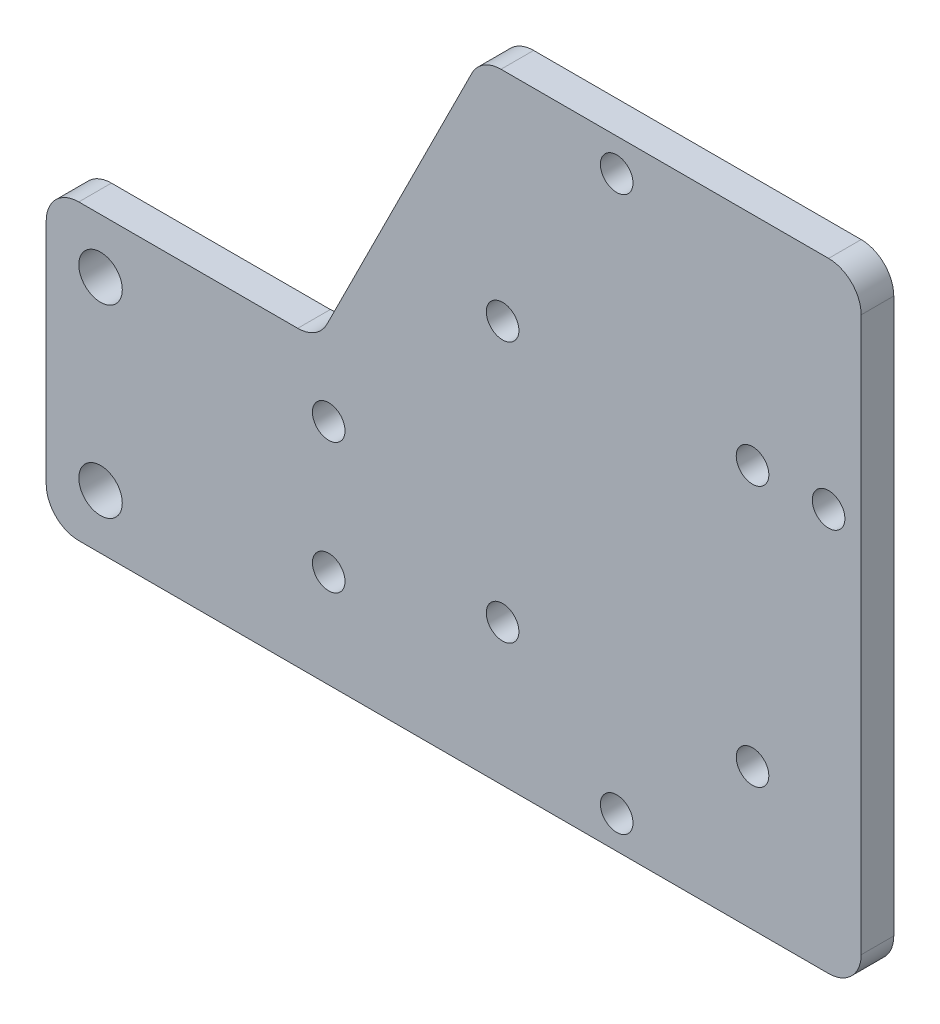
ISO-10303-21;
HEADER;
FILE_DESCRIPTION(('STEP AP214'),'2;1');
FILE_NAME('part.step','',(''),(''),'','','');
FILE_SCHEMA(('AUTOMOTIVE_DESIGN { 1 0 10303 214 1 1 1 1 }'));
ENDSEC;
DATA;
#1=APPLICATION_CONTEXT('core data for automotive mechanical design processes');
#2=APPLICATION_PROTOCOL_DEFINITION('international standard','automotive_design',2000,#1);
#3=PRODUCT_CONTEXT('',#1,'mechanical');
#4=PRODUCT('Part','Part','',(#3));
#5=PRODUCT_RELATED_PRODUCT_CATEGORY('part','',(#4));
#6=PRODUCT_DEFINITION_FORMATION('','',#4);
#7=PRODUCT_DEFINITION_CONTEXT('part definition',#1,'design');
#8=PRODUCT_DEFINITION('design','',#6,#7);
#9=PRODUCT_DEFINITION_SHAPE('','',#8);
#10=(LENGTH_UNIT() NAMED_UNIT(*) SI_UNIT(.MILLI.,.METRE.));
#11=(NAMED_UNIT(*) PLANE_ANGLE_UNIT() SI_UNIT($,.RADIAN.));
#12=(NAMED_UNIT(*) SI_UNIT($,.STERADIAN.) SOLID_ANGLE_UNIT());
#13=UNCERTAINTY_MEASURE_WITH_UNIT(LENGTH_MEASURE(1.E-05),#10,'distance_accuracy_value','');
#14=(GEOMETRIC_REPRESENTATION_CONTEXT(3) GLOBAL_UNCERTAINTY_ASSIGNED_CONTEXT((#13)) GLOBAL_UNIT_ASSIGNED_CONTEXT((#10,
#11,#12)) REPRESENTATION_CONTEXT('',''));
#15=CARTESIAN_POINT('',(0.,0.,0.));
#16=DIRECTION('',(0.,0.,1.));
#17=DIRECTION('',(1.,0.,0.));
#18=AXIS2_PLACEMENT_3D('',#15,#16,#17);
#19=CARTESIAN_POINT('',(0.,0.,3.));
#20=DIRECTION('',(1.,0.,0.));
#21=DIRECTION('',(0.,0.,-1.));
#22=AXIS2_PLACEMENT_3D('',#19,#20,#21);
#23=PLANE('',#22);
#24=DIRECTION('',(0.,-1.,0.));
#25=VECTOR('',#24,1.);
#26=CARTESIAN_POINT('',(0.,0.,3.));
#27=LINE('',#26,#25);
#28=CARTESIAN_POINT('',(0.,24.,3.));
#29=VERTEX_POINT('',#28);
#30=CARTESIAN_POINT('',(0.,3.,3.));
#31=VERTEX_POINT('',#30);
#32=EDGE_CURVE('E142',#29,#31,#27,.T.);
#33=ORIENTED_EDGE('',*,*,#32,.F.);
#34=DIRECTION('',(0.,0.,-1.));
#35=VECTOR('',#34,1.);
#36=CARTESIAN_POINT('',(0.,24.,3.));
#37=LINE('',#36,#35);
#38=CARTESIAN_POINT('',(0.,24.,0.));
#39=VERTEX_POINT('',#38);
#40=EDGE_CURVE('E127',#29,#39,#37,.T.);
#41=ORIENTED_EDGE('',*,*,#40,.T.);
#42=DIRECTION('',(0.,-1.,0.));
#43=VECTOR('',#42,1.);
#44=CARTESIAN_POINT('',(0.,0.,0.));
#45=LINE('',#44,#43);
#46=CARTESIAN_POINT('',(0.,3.,0.));
#47=VERTEX_POINT('',#46);
#48=EDGE_CURVE('E139',#39,#47,#45,.T.);
#49=ORIENTED_EDGE('',*,*,#48,.T.);
#50=DIRECTION('',(0.,0.,-1.));
#51=VECTOR('',#50,1.);
#52=CARTESIAN_POINT('',(0.,3.,3.));
#53=LINE('',#52,#51);
#54=EDGE_CURVE('E144',#47,#31,#53,.F.);
#55=ORIENTED_EDGE('',*,*,#54,.T.);
#56=EDGE_LOOP('',(#33,#41,#49,#55));
#57=FACE_BOUND('',#56,.T.);
#58=ADVANCED_FACE('F33',(#57),#23,.F.);
#59=CARTESIAN_POINT('',(0.,0.,3.));
#60=DIRECTION('',(0.,1.,0.));
#61=DIRECTION('',(0.,0.,1.));
#62=AXIS2_PLACEMENT_3D('',#59,#60,#61);
#63=PLANE('',#62);
#64=DIRECTION('',(1.,0.,0.));
#65=VECTOR('',#64,1.);
#66=CARTESIAN_POINT('',(0.,0.,0.));
#67=LINE('',#66,#65);
#68=CARTESIAN_POINT('',(3.,0.,0.));
#69=VERTEX_POINT('',#68);
#70=CARTESIAN_POINT('',(72.,0.,0.));
#71=VERTEX_POINT('',#70);
#72=EDGE_CURVE('E149',#69,#71,#67,.T.);
#73=ORIENTED_EDGE('',*,*,#72,.T.);
#74=DIRECTION('',(0.,0.,-1.));
#75=VECTOR('',#74,1.);
#76=CARTESIAN_POINT('',(72.,0.,3.));
#77=LINE('',#76,#75);
#78=CARTESIAN_POINT('',(72.,0.,3.));
#79=VERTEX_POINT('',#78);
#80=EDGE_CURVE('E206',#71,#79,#77,.F.);
#81=ORIENTED_EDGE('',*,*,#80,.T.);
#82=DIRECTION('',(1.,0.,0.));
#83=VECTOR('',#82,1.);
#84=CARTESIAN_POINT('',(0.,0.,3.));
#85=LINE('',#84,#83);
#86=CARTESIAN_POINT('',(3.,0.,3.));
#87=VERTEX_POINT('',#86);
#88=EDGE_CURVE('E226',#87,#79,#85,.T.);
#89=ORIENTED_EDGE('',*,*,#88,.F.);
#90=DIRECTION('',(0.,0.,-1.));
#91=VECTOR('',#90,1.);
#92=CARTESIAN_POINT('',(3.,0.,3.));
#93=LINE('',#92,#91);
#94=EDGE_CURVE('E203',#87,#69,#93,.T.);
#95=ORIENTED_EDGE('',*,*,#94,.T.);
#96=EDGE_LOOP('',(#73,#81,#89,#95));
#97=FACE_BOUND('',#96,.T.);
#98=ADVANCED_FACE('F341',(#97),#63,.F.);
#99=CARTESIAN_POINT('',(75.,0.,3.));
#100=DIRECTION('',(-1.,0.,0.));
#101=DIRECTION('',(0.,0.,1.));
#102=AXIS2_PLACEMENT_3D('',#99,#100,#101);
#103=PLANE('',#102);
#104=DIRECTION('',(0.,1.,0.));
#105=VECTOR('',#104,1.);
#106=CARTESIAN_POINT('',(75.,0.,3.));
#107=LINE('',#106,#105);
#108=CARTESIAN_POINT('',(75.,3.,3.));
#109=VERTEX_POINT('',#108);
#110=CARTESIAN_POINT('',(75.,54.,3.));
#111=VERTEX_POINT('',#110);
#112=EDGE_CURVE('E221',#109,#111,#107,.T.);
#113=ORIENTED_EDGE('',*,*,#112,.F.);
#114=DIRECTION('',(0.,0.,-1.));
#115=VECTOR('',#114,1.);
#116=CARTESIAN_POINT('',(75.,3.,3.));
#117=LINE('',#116,#115);
#118=CARTESIAN_POINT('',(75.,3.,0.));
#119=VERTEX_POINT('',#118);
#120=EDGE_CURVE('E200',#109,#119,#117,.T.);
#121=ORIENTED_EDGE('',*,*,#120,.T.);
#122=DIRECTION('',(0.,1.,0.));
#123=VECTOR('',#122,1.);
#124=CARTESIAN_POINT('',(75.,0.,0.));
#125=LINE('',#124,#123);
#126=CARTESIAN_POINT('',(75.,54.,0.));
#127=VERTEX_POINT('',#126);
#128=EDGE_CURVE('E153',#119,#127,#125,.T.);
#129=ORIENTED_EDGE('',*,*,#128,.T.);
#130=DIRECTION('',(0.,0.,-1.));
#131=VECTOR('',#130,1.);
#132=CARTESIAN_POINT('',(75.,54.,3.));
#133=LINE('',#132,#131);
#134=EDGE_CURVE('E198',#127,#111,#133,.F.);
#135=ORIENTED_EDGE('',*,*,#134,.T.);
#136=EDGE_LOOP('',(#113,#121,#129,#135));
#137=FACE_BOUND('',#136,.T.);
#138=ADVANCED_FACE('F347',(#137),#103,.F.);
#139=CARTESIAN_POINT('',(40.,57.,3.));
#140=DIRECTION('',(0.,-1.,0.));
#141=DIRECTION('',(0.,0.,-1.));
#142=AXIS2_PLACEMENT_3D('',#139,#140,#141);
#143=PLANE('',#142);
#144=DIRECTION('',(-1.,0.,0.));
#145=VECTOR('',#144,1.);
#146=CARTESIAN_POINT('',(40.,57.,0.));
#147=LINE('',#146,#145);
#148=CARTESIAN_POINT('',(72.,57.,0.));
#149=VERTEX_POINT('',#148);
#150=CARTESIAN_POINT('',(41.8541019662497,57.,0.));
#151=VERTEX_POINT('',#150);
#152=EDGE_CURVE('E164',#149,#151,#147,.T.);
#153=ORIENTED_EDGE('',*,*,#152,.T.);
#154=DIRECTION('',(0.,0.,-1.));
#155=VECTOR('',#154,1.);
#156=CARTESIAN_POINT('',(41.8541019662497,57.,3.));
#157=LINE('',#156,#155);
#158=CARTESIAN_POINT('',(41.8541019662497,57.,3.));
#159=VERTEX_POINT('',#158);
#160=EDGE_CURVE('E196',#151,#159,#157,.F.);
#161=ORIENTED_EDGE('',*,*,#160,.T.);
#162=DIRECTION('',(-1.,0.,0.));
#163=VECTOR('',#162,1.);
#164=CARTESIAN_POINT('',(40.,57.,3.));
#165=LINE('',#164,#163);
#166=CARTESIAN_POINT('',(72.,57.,3.));
#167=VERTEX_POINT('',#166);
#168=EDGE_CURVE('E220',#167,#159,#165,.T.);
#169=ORIENTED_EDGE('',*,*,#168,.F.);
#170=DIRECTION('',(0.,0.,-1.));
#171=VECTOR('',#170,1.);
#172=CARTESIAN_POINT('',(72.,57.,3.));
#173=LINE('',#172,#171);
#174=EDGE_CURVE('E193',#167,#149,#173,.T.);
#175=ORIENTED_EDGE('',*,*,#174,.T.);
#176=EDGE_LOOP('',(#153,#161,#169,#175));
#177=FACE_BOUND('',#176,.T.);
#178=ADVANCED_FACE('F385',(#177),#143,.F.);
#179=CARTESIAN_POINT('',(40.,57.,3.));
#180=DIRECTION('',(0.894427190999916,-0.447213595499958,0.));
#181=DIRECTION('',(0.447213595499958,0.894427190999916,0.));
#182=AXIS2_PLACEMENT_3D('',#179,#180,#181);
#183=PLANE('',#182);
#184=DIRECTION('',(-0.447213595499958,-0.894427190999916,0.));
#185=VECTOR('',#184,1.);
#186=CARTESIAN_POINT('',(40.,57.,0.));
#187=LINE('',#186,#185);
#188=CARTESIAN_POINT('',(39.1708203932499,55.3416407864999,0.));
#189=VERTEX_POINT('',#188);
#190=CARTESIAN_POINT('',(25.8291796067501,28.6583592135001,0.));
#191=VERTEX_POINT('',#190);
#192=EDGE_CURVE('E167',#189,#191,#187,.T.);
#193=ORIENTED_EDGE('',*,*,#192,.T.);
#194=DIRECTION('',(0.,0.,-1.));
#195=VECTOR('',#194,1.);
#196=CARTESIAN_POINT('',(25.8291796067501,28.6583592135001,3.));
#197=LINE('',#196,#195);
#198=CARTESIAN_POINT('',(25.8291796067501,28.6583592135001,3.));
#199=VERTEX_POINT('',#198);
#200=EDGE_CURVE('E48',#191,#199,#197,.F.);
#201=ORIENTED_EDGE('',*,*,#200,.T.);
#202=DIRECTION('',(-0.447213595499958,-0.894427190999916,0.));
#203=VECTOR('',#202,1.);
#204=CARTESIAN_POINT('',(40.,57.,3.));
#205=LINE('',#204,#203);
#206=CARTESIAN_POINT('',(39.1708203932499,55.3416407864999,3.));
#207=VERTEX_POINT('',#206);
#208=EDGE_CURVE('E217',#207,#199,#205,.T.);
#209=ORIENTED_EDGE('',*,*,#208,.F.);
#210=DIRECTION('',(0.,0.,-1.));
#211=VECTOR('',#210,1.);
#212=CARTESIAN_POINT('',(39.1708203932499,55.3416407864999,3.));
#213=LINE('',#212,#211);
#214=EDGE_CURVE('E189',#207,#189,#213,.T.);
#215=ORIENTED_EDGE('',*,*,#214,.T.);
#216=EDGE_LOOP('',(#193,#201,#209,#215));
#217=FACE_BOUND('',#216,.T.);
#218=ADVANCED_FACE('F210',(#217),#183,.F.);
#219=CARTESIAN_POINT('',(0.,27.,3.));
#220=DIRECTION('',(0.,-1.,0.));
#221=DIRECTION('',(0.,0.,-1.));
#222=AXIS2_PLACEMENT_3D('',#219,#220,#221);
#223=PLANE('',#222);
#224=DIRECTION('',(-1.,0.,0.));
#225=VECTOR('',#224,1.);
#226=CARTESIAN_POINT('',(0.,27.,0.));
#227=LINE('',#226,#225);
#228=CARTESIAN_POINT('',(23.1458980337503,27.,0.));
#229=VERTEX_POINT('',#228);
#230=CARTESIAN_POINT('',(3.,27.,0.));
#231=VERTEX_POINT('',#230);
#232=EDGE_CURVE('E169',#229,#231,#227,.T.);
#233=ORIENTED_EDGE('',*,*,#232,.T.);
#234=DIRECTION('',(0.,0.,-1.));
#235=VECTOR('',#234,1.);
#236=CARTESIAN_POINT('',(3.,27.,3.));
#237=LINE('',#236,#235);
#238=CARTESIAN_POINT('',(3.,27.,3.));
#239=VERTEX_POINT('',#238);
#240=EDGE_CURVE('E128',#231,#239,#237,.F.);
#241=ORIENTED_EDGE('',*,*,#240,.T.);
#242=DIRECTION('',(-1.,0.,0.));
#243=VECTOR('',#242,1.);
#244=CARTESIAN_POINT('',(0.,27.,3.));
#245=LINE('',#244,#243);
#246=CARTESIAN_POINT('',(23.1458980337503,27.,3.));
#247=VERTEX_POINT('',#246);
#248=EDGE_CURVE('E159',#247,#239,#245,.T.);
#249=ORIENTED_EDGE('',*,*,#248,.F.);
#250=DIRECTION('',(0.,0.,-1.));
#251=VECTOR('',#250,1.);
#252=CARTESIAN_POINT('',(23.1458980337503,27.,0.));
#253=LINE('',#252,#251);
#254=EDGE_CURVE('E133',#247,#229,#253,.T.);
#255=ORIENTED_EDGE('',*,*,#254,.T.);
#256=EDGE_LOOP('',(#233,#241,#249,#255));
#257=FACE_BOUND('',#256,.T.);
#258=ADVANCED_FACE('F219',(#257),#223,.F.);
#259=CARTESIAN_POINT('',(0.,0.,3.));
#260=DIRECTION('',(0.,0.,-1.));
#261=DIRECTION('',(-1.,0.,0.));
#262=AXIS2_PLACEMENT_3D('',#259,#260,#261);
#263=PLANE('',#262);
#264=CARTESIAN_POINT('',(26.,9.,3.));
#265=DIRECTION('',(0.,0.,1.));
#266=DIRECTION('',(1.,0.,0.));
#267=AXIS2_PLACEMENT_3D('',#264,#265,#266);
#268=CIRCLE('',#267,1.5);
#269=CARTESIAN_POINT('',(27.5,9.,3.));
#270=VERTEX_POINT('',#269);
#271=EDGE_CURVE('E287',#270,#270,#268,.T.);
#272=ORIENTED_EDGE('',*,*,#271,.F.);
#273=EDGE_LOOP('',(#272));
#274=FACE_BOUND('',#273,.T.);
#275=CARTESIAN_POINT('',(26.,21.,3.));
#276=DIRECTION('',(0.,0.,1.));
#277=DIRECTION('',(1.,0.,0.));
#278=AXIS2_PLACEMENT_3D('',#275,#276,#277);
#279=CIRCLE('',#278,1.5);
#280=CARTESIAN_POINT('',(27.5,21.,3.));
#281=VERTEX_POINT('',#280);
#282=EDGE_CURVE('E281',#281,#281,#279,.T.);
#283=ORIENTED_EDGE('',*,*,#282,.F.);
#284=EDGE_LOOP('',(#283));
#285=FACE_BOUND('',#284,.T.);
#286=CARTESIAN_POINT('',(72.,37.,3.));
#287=DIRECTION('',(0.,0.,1.));
#288=DIRECTION('',(1.,0.,0.));
#289=AXIS2_PLACEMENT_3D('',#286,#287,#288);
#290=CIRCLE('',#289,1.5);
#291=CARTESIAN_POINT('',(73.5,37.,3.));
#292=VERTEX_POINT('',#291);
#293=EDGE_CURVE('E275',#292,#292,#290,.T.);
#294=ORIENTED_EDGE('',*,*,#293,.F.);
#295=EDGE_LOOP('',(#294));
#296=FACE_BOUND('',#295,.T.);
#297=CARTESIAN_POINT('',(52.5,54.,3.));
#298=DIRECTION('',(0.,0.,1.));
#299=DIRECTION('',(1.,0.,0.));
#300=AXIS2_PLACEMENT_3D('',#297,#298,#299);
#301=CIRCLE('',#300,1.5);
#302=CARTESIAN_POINT('',(54.,54.,3.));
#303=VERTEX_POINT('',#302);
#304=EDGE_CURVE('E269',#303,#303,#301,.T.);
#305=ORIENTED_EDGE('',*,*,#304,.F.);
#306=EDGE_LOOP('',(#305));
#307=FACE_BOUND('',#306,.T.);
#308=CARTESIAN_POINT('',(52.5,3.,3.));
#309=DIRECTION('',(0.,0.,1.));
#310=DIRECTION('',(1.,0.,0.));
#311=AXIS2_PLACEMENT_3D('',#308,#309,#310);
#312=CIRCLE('',#311,1.5);
#313=CARTESIAN_POINT('',(54.,3.,3.));
#314=VERTEX_POINT('',#313);
#315=EDGE_CURVE('E263',#314,#314,#312,.T.);
#316=ORIENTED_EDGE('',*,*,#315,.F.);
#317=EDGE_LOOP('',(#316));
#318=FACE_BOUND('',#317,.T.);
#319=CARTESIAN_POINT('',(5.,5.,3.));
#320=DIRECTION('',(0.,0.,1.));
#321=DIRECTION('',(1.,0.,0.));
#322=AXIS2_PLACEMENT_3D('',#319,#320,#321);
#323=CIRCLE('',#322,2.);
#324=CARTESIAN_POINT('',(7.,5.,3.));
#325=VERTEX_POINT('',#324);
#326=EDGE_CURVE('E257',#325,#325,#323,.T.);
#327=ORIENTED_EDGE('',*,*,#326,.F.);
#328=EDGE_LOOP('',(#327));
#329=FACE_BOUND('',#328,.T.);
#330=CARTESIAN_POINT('',(5.,22.,3.));
#331=DIRECTION('',(0.,0.,1.));
#332=DIRECTION('',(1.,0.,0.));
#333=AXIS2_PLACEMENT_3D('',#330,#331,#332);
#334=CIRCLE('',#333,2.);
#335=CARTESIAN_POINT('',(7.,22.,3.));
#336=VERTEX_POINT('',#335);
#337=EDGE_CURVE('E251',#336,#336,#334,.T.);
#338=ORIENTED_EDGE('',*,*,#337,.F.);
#339=EDGE_LOOP('',(#338));
#340=FACE_BOUND('',#339,.T.);
#341=CARTESIAN_POINT('',(65.,37.,3.));
#342=DIRECTION('',(0.,0.,1.));
#343=DIRECTION('',(-1.,0.,0.));
#344=AXIS2_PLACEMENT_3D('',#341,#342,#343);
#345=CIRCLE('',#344,1.5);
#346=CARTESIAN_POINT('',(63.5,37.,3.));
#347=VERTEX_POINT('',#346);
#348=EDGE_CURVE('E245',#347,#347,#345,.T.);
#349=ORIENTED_EDGE('',*,*,#348,.F.);
#350=EDGE_LOOP('',(#349));
#351=FACE_BOUND('',#350,.T.);
#352=CARTESIAN_POINT('',(65.,13.,3.));
#353=DIRECTION('',(0.,0.,1.));
#354=DIRECTION('',(1.,0.,0.));
#355=AXIS2_PLACEMENT_3D('',#352,#353,#354);
#356=CIRCLE('',#355,1.5);
#357=CARTESIAN_POINT('',(66.5,13.,3.));
#358=VERTEX_POINT('',#357);
#359=EDGE_CURVE('E239',#358,#358,#356,.T.);
#360=ORIENTED_EDGE('',*,*,#359,.F.);
#361=EDGE_LOOP('',(#360));
#362=FACE_BOUND('',#361,.T.);
#363=CARTESIAN_POINT('',(42.,13.,3.));
#364=DIRECTION('',(0.,0.,1.));
#365=DIRECTION('',(-1.,0.,0.));
#366=AXIS2_PLACEMENT_3D('',#363,#364,#365);
#367=CIRCLE('',#366,1.5);
#368=CARTESIAN_POINT('',(40.5,13.,3.));
#369=VERTEX_POINT('',#368);
#370=EDGE_CURVE('E233',#369,#369,#367,.T.);
#371=ORIENTED_EDGE('',*,*,#370,.F.);
#372=EDGE_LOOP('',(#371));
#373=FACE_BOUND('',#372,.T.);
#374=CARTESIAN_POINT('',(42.,37.,3.));
#375=DIRECTION('',(0.,0.,1.));
#376=DIRECTION('',(1.,0.,0.));
#377=AXIS2_PLACEMENT_3D('',#374,#375,#376);
#378=CIRCLE('',#377,1.5);
#379=CARTESIAN_POINT('',(43.5,37.,3.));
#380=VERTEX_POINT('',#379);
#381=EDGE_CURVE('E156',#380,#380,#378,.T.);
#382=ORIENTED_EDGE('',*,*,#381,.F.);
#383=EDGE_LOOP('',(#382));
#384=FACE_BOUND('',#383,.T.);
#385=ORIENTED_EDGE('',*,*,#248,.T.);
#386=CARTESIAN_POINT('',(3.,24.,3.));
#387=DIRECTION('',(0.,0.,-1.));
#388=DIRECTION('',(-1.,0.,0.));
#389=AXIS2_PLACEMENT_3D('',#386,#387,#388);
#390=CIRCLE('',#389,3.);
#391=EDGE_CURVE('E187',#239,#29,#390,.F.);
#392=ORIENTED_EDGE('',*,*,#391,.T.);
#393=ORIENTED_EDGE('',*,*,#32,.T.);
#394=CARTESIAN_POINT('',(3.,3.,3.));
#395=DIRECTION('',(0.,0.,-1.));
#396=DIRECTION('',(-1.,0.,0.));
#397=AXIS2_PLACEMENT_3D('',#394,#395,#396);
#398=CIRCLE('',#397,3.);
#399=EDGE_CURVE('E182',#31,#87,#398,.F.);
#400=ORIENTED_EDGE('',*,*,#399,.T.);
#401=ORIENTED_EDGE('',*,*,#88,.T.);
#402=CARTESIAN_POINT('',(72.,3.,3.));
#403=DIRECTION('',(0.,0.,-1.));
#404=DIRECTION('',(-1.,0.,0.));
#405=AXIS2_PLACEMENT_3D('',#402,#403,#404);
#406=CIRCLE('',#405,3.);
#407=EDGE_CURVE('E184',#79,#109,#406,.F.);
#408=ORIENTED_EDGE('',*,*,#407,.T.);
#409=ORIENTED_EDGE('',*,*,#112,.T.);
#410=CARTESIAN_POINT('',(72.,54.,3.));
#411=DIRECTION('',(0.,0.,-1.));
#412=DIRECTION('',(-1.,0.,0.));
#413=AXIS2_PLACEMENT_3D('',#410,#411,#412);
#414=CIRCLE('',#413,3.);
#415=EDGE_CURVE('E180',#111,#167,#414,.F.);
#416=ORIENTED_EDGE('',*,*,#415,.T.);
#417=ORIENTED_EDGE('',*,*,#168,.T.);
#418=CARTESIAN_POINT('',(41.8541019662497,54.,3.));
#419=DIRECTION('',(0.,0.,-1.));
#420=DIRECTION('',(-1.,0.,0.));
#421=AXIS2_PLACEMENT_3D('',#418,#419,#420);
#422=CIRCLE('',#421,3.);
#423=EDGE_CURVE('E55',#159,#207,#422,.F.);
#424=ORIENTED_EDGE('',*,*,#423,.T.);
#425=ORIENTED_EDGE('',*,*,#208,.T.);
#426=CARTESIAN_POINT('',(23.1458980337503,30.,3.));
#427=DIRECTION('',(0.,0.,-1.));
#428=DIRECTION('',(-1.,0.,0.));
#429=AXIS2_PLACEMENT_3D('',#426,#427,#428);
#430=CIRCLE('',#429,3.);
#431=EDGE_CURVE('E11',#199,#247,#430,.T.);
#432=ORIENTED_EDGE('',*,*,#431,.T.);
#433=EDGE_LOOP('',(#385,#392,#393,#400,#401,#408,#409,#416,#417,#424,#425,#432));
#434=FACE_BOUND('',#433,.T.);
#435=ADVANCED_FACE('F216',(#274,#285,#296,#307,#318,#329,#340,#351,#362,#373,#384,#434),#263,.F.);
#436=CARTESIAN_POINT('',(0.,0.,0.));
#437=DIRECTION('',(0.,0.,-1.));
#438=DIRECTION('',(-1.,0.,0.));
#439=AXIS2_PLACEMENT_3D('',#436,#437,#438);
#440=PLANE('',#439);
#441=CARTESIAN_POINT('',(26.,9.,0.));
#442=DIRECTION('',(0.,0.,1.));
#443=DIRECTION('',(1.,0.,0.));
#444=AXIS2_PLACEMENT_3D('',#441,#442,#443);
#445=CIRCLE('',#444,1.5);
#446=CARTESIAN_POINT('',(27.5,9.,0.));
#447=VERTEX_POINT('',#446);
#448=EDGE_CURVE('E284',#447,#447,#445,.T.);
#449=ORIENTED_EDGE('',*,*,#448,.T.);
#450=EDGE_LOOP('',(#449));
#451=FACE_BOUND('',#450,.T.);
#452=CARTESIAN_POINT('',(26.,21.,0.));
#453=DIRECTION('',(0.,0.,1.));
#454=DIRECTION('',(1.,0.,0.));
#455=AXIS2_PLACEMENT_3D('',#452,#453,#454);
#456=CIRCLE('',#455,1.5);
#457=CARTESIAN_POINT('',(27.5,21.,0.));
#458=VERTEX_POINT('',#457);
#459=EDGE_CURVE('E278',#458,#458,#456,.T.);
#460=ORIENTED_EDGE('',*,*,#459,.T.);
#461=EDGE_LOOP('',(#460));
#462=FACE_BOUND('',#461,.T.);
#463=CARTESIAN_POINT('',(72.,37.,0.));
#464=DIRECTION('',(0.,0.,1.));
#465=DIRECTION('',(1.,0.,0.));
#466=AXIS2_PLACEMENT_3D('',#463,#464,#465);
#467=CIRCLE('',#466,1.5);
#468=CARTESIAN_POINT('',(73.5,37.,0.));
#469=VERTEX_POINT('',#468);
#470=EDGE_CURVE('E272',#469,#469,#467,.T.);
#471=ORIENTED_EDGE('',*,*,#470,.T.);
#472=EDGE_LOOP('',(#471));
#473=FACE_BOUND('',#472,.T.);
#474=CARTESIAN_POINT('',(52.5,54.,0.));
#475=DIRECTION('',(0.,0.,1.));
#476=DIRECTION('',(1.,0.,0.));
#477=AXIS2_PLACEMENT_3D('',#474,#475,#476);
#478=CIRCLE('',#477,1.5);
#479=CARTESIAN_POINT('',(54.,54.,0.));
#480=VERTEX_POINT('',#479);
#481=EDGE_CURVE('E266',#480,#480,#478,.T.);
#482=ORIENTED_EDGE('',*,*,#481,.T.);
#483=EDGE_LOOP('',(#482));
#484=FACE_BOUND('',#483,.T.);
#485=CARTESIAN_POINT('',(52.5,3.,0.));
#486=DIRECTION('',(0.,0.,1.));
#487=DIRECTION('',(1.,0.,0.));
#488=AXIS2_PLACEMENT_3D('',#485,#486,#487);
#489=CIRCLE('',#488,1.5);
#490=CARTESIAN_POINT('',(54.,3.,0.));
#491=VERTEX_POINT('',#490);
#492=EDGE_CURVE('E260',#491,#491,#489,.T.);
#493=ORIENTED_EDGE('',*,*,#492,.T.);
#494=EDGE_LOOP('',(#493));
#495=FACE_BOUND('',#494,.T.);
#496=CARTESIAN_POINT('',(5.,5.,0.));
#497=DIRECTION('',(0.,0.,1.));
#498=DIRECTION('',(1.,0.,0.));
#499=AXIS2_PLACEMENT_3D('',#496,#497,#498);
#500=CIRCLE('',#499,2.);
#501=CARTESIAN_POINT('',(7.,5.,0.));
#502=VERTEX_POINT('',#501);
#503=EDGE_CURVE('E254',#502,#502,#500,.T.);
#504=ORIENTED_EDGE('',*,*,#503,.T.);
#505=EDGE_LOOP('',(#504));
#506=FACE_BOUND('',#505,.T.);
#507=CARTESIAN_POINT('',(5.,22.,0.));
#508=DIRECTION('',(0.,0.,1.));
#509=DIRECTION('',(1.,0.,0.));
#510=AXIS2_PLACEMENT_3D('',#507,#508,#509);
#511=CIRCLE('',#510,2.);
#512=CARTESIAN_POINT('',(7.,22.,0.));
#513=VERTEX_POINT('',#512);
#514=EDGE_CURVE('E248',#513,#513,#511,.T.);
#515=ORIENTED_EDGE('',*,*,#514,.T.);
#516=EDGE_LOOP('',(#515));
#517=FACE_BOUND('',#516,.T.);
#518=CARTESIAN_POINT('',(65.,37.,0.));
#519=DIRECTION('',(0.,0.,1.));
#520=DIRECTION('',(-1.,0.,0.));
#521=AXIS2_PLACEMENT_3D('',#518,#519,#520);
#522=CIRCLE('',#521,1.5);
#523=CARTESIAN_POINT('',(63.5,37.,0.));
#524=VERTEX_POINT('',#523);
#525=EDGE_CURVE('E242',#524,#524,#522,.T.);
#526=ORIENTED_EDGE('',*,*,#525,.T.);
#527=EDGE_LOOP('',(#526));
#528=FACE_BOUND('',#527,.T.);
#529=CARTESIAN_POINT('',(65.,13.,0.));
#530=DIRECTION('',(0.,0.,1.));
#531=DIRECTION('',(1.,0.,0.));
#532=AXIS2_PLACEMENT_3D('',#529,#530,#531);
#533=CIRCLE('',#532,1.5);
#534=CARTESIAN_POINT('',(66.5,13.,0.));
#535=VERTEX_POINT('',#534);
#536=EDGE_CURVE('E236',#535,#535,#533,.T.);
#537=ORIENTED_EDGE('',*,*,#536,.T.);
#538=EDGE_LOOP('',(#537));
#539=FACE_BOUND('',#538,.T.);
#540=CARTESIAN_POINT('',(42.,13.,0.));
#541=DIRECTION('',(0.,0.,1.));
#542=DIRECTION('',(-1.,0.,0.));
#543=AXIS2_PLACEMENT_3D('',#540,#541,#542);
#544=CIRCLE('',#543,1.5);
#545=CARTESIAN_POINT('',(40.5,13.,0.));
#546=VERTEX_POINT('',#545);
#547=EDGE_CURVE('E231',#546,#546,#544,.T.);
#548=ORIENTED_EDGE('',*,*,#547,.T.);
#549=EDGE_LOOP('',(#548));
#550=FACE_BOUND('',#549,.T.);
#551=CARTESIAN_POINT('',(42.,37.,0.));
#552=DIRECTION('',(0.,0.,1.));
#553=DIRECTION('',(1.,0.,0.));
#554=AXIS2_PLACEMENT_3D('',#551,#552,#553);
#555=CIRCLE('',#554,1.5);
#556=CARTESIAN_POINT('',(43.5,37.,0.));
#557=VERTEX_POINT('',#556);
#558=EDGE_CURVE('E150',#557,#557,#555,.T.);
#559=ORIENTED_EDGE('',*,*,#558,.T.);
#560=EDGE_LOOP('',(#559));
#561=FACE_BOUND('',#560,.T.);
#562=ORIENTED_EDGE('',*,*,#48,.F.);
#563=CARTESIAN_POINT('',(3.,24.,0.));
#564=DIRECTION('',(0.,0.,-1.));
#565=DIRECTION('',(-1.,0.,0.));
#566=AXIS2_PLACEMENT_3D('',#563,#564,#565);
#567=CIRCLE('',#566,3.);
#568=EDGE_CURVE('E123',#39,#231,#567,.T.);
#569=ORIENTED_EDGE('',*,*,#568,.T.);
#570=ORIENTED_EDGE('',*,*,#232,.F.);
#571=CARTESIAN_POINT('',(23.1458980337503,30.,0.));
#572=DIRECTION('',(0.,0.,-1.));
#573=DIRECTION('',(-1.,0.,0.));
#574=AXIS2_PLACEMENT_3D('',#571,#572,#573);
#575=CIRCLE('',#574,3.);
#576=EDGE_CURVE('E41',#229,#191,#575,.F.);
#577=ORIENTED_EDGE('',*,*,#576,.T.);
#578=ORIENTED_EDGE('',*,*,#192,.F.);
#579=CARTESIAN_POINT('',(41.8541019662497,54.,0.));
#580=DIRECTION('',(0.,0.,-1.));
#581=DIRECTION('',(-1.,0.,0.));
#582=AXIS2_PLACEMENT_3D('',#579,#580,#581);
#583=CIRCLE('',#582,3.);
#584=EDGE_CURVE('E134',#189,#151,#583,.T.);
#585=ORIENTED_EDGE('',*,*,#584,.T.);
#586=ORIENTED_EDGE('',*,*,#152,.F.);
#587=CARTESIAN_POINT('',(72.,54.,0.));
#588=DIRECTION('',(0.,0.,-1.));
#589=DIRECTION('',(-1.,0.,0.));
#590=AXIS2_PLACEMENT_3D('',#587,#588,#589);
#591=CIRCLE('',#590,3.);
#592=EDGE_CURVE('E143',#149,#127,#591,.T.);
#593=ORIENTED_EDGE('',*,*,#592,.T.);
#594=ORIENTED_EDGE('',*,*,#128,.F.);
#595=CARTESIAN_POINT('',(72.,3.,0.));
#596=DIRECTION('',(0.,0.,-1.));
#597=DIRECTION('',(-1.,0.,0.));
#598=AXIS2_PLACEMENT_3D('',#595,#596,#597);
#599=CIRCLE('',#598,3.);
#600=EDGE_CURVE('E174',#119,#71,#599,.T.);
#601=ORIENTED_EDGE('',*,*,#600,.T.);
#602=ORIENTED_EDGE('',*,*,#72,.F.);
#603=CARTESIAN_POINT('',(3.,3.,0.));
#604=DIRECTION('',(0.,0.,-1.));
#605=DIRECTION('',(-1.,0.,0.));
#606=AXIS2_PLACEMENT_3D('',#603,#604,#605);
#607=CIRCLE('',#606,3.);
#608=EDGE_CURVE('E148',#69,#47,#607,.T.);
#609=ORIENTED_EDGE('',*,*,#608,.T.);
#610=EDGE_LOOP('',(#562,#569,#570,#577,#578,#585,#586,#593,#594,#601,#602,#609));
#611=FACE_BOUND('',#610,.T.);
#612=ADVANCED_FACE('F146',(#451,#462,#473,#484,#495,#506,#517,#528,#539,#550,#561,#611),#440,.T.);
#613=CARTESIAN_POINT('',(42.,37.,0.));
#614=DIRECTION('',(0.,0.,1.));
#615=DIRECTION('',(1.,0.,0.));
#616=AXIS2_PLACEMENT_3D('',#613,#614,#615);
#617=CYLINDRICAL_SURFACE('',#616,1.5);
#618=ORIENTED_EDGE('',*,*,#558,.F.);
#619=EDGE_LOOP('',(#618));
#620=FACE_BOUND('',#619,.T.);
#621=ORIENTED_EDGE('',*,*,#381,.T.);
#622=EDGE_LOOP('',(#621));
#623=FACE_BOUND('',#622,.T.);
#624=ADVANCED_FACE('F325',(#620,#623),#617,.F.);
#625=CARTESIAN_POINT('',(42.,13.,0.));
#626=DIRECTION('',(0.,0.,1.));
#627=DIRECTION('',(1.,0.,0.));
#628=AXIS2_PLACEMENT_3D('',#625,#626,#627);
#629=CYLINDRICAL_SURFACE('',#628,1.5);
#630=ORIENTED_EDGE('',*,*,#547,.F.);
#631=EDGE_LOOP('',(#630));
#632=FACE_BOUND('',#631,.T.);
#633=ORIENTED_EDGE('',*,*,#370,.T.);
#634=EDGE_LOOP('',(#633));
#635=FACE_BOUND('',#634,.T.);
#636=ADVANCED_FACE('F327',(#632,#635),#629,.F.);
#637=CARTESIAN_POINT('',(65.,13.,0.));
#638=DIRECTION('',(0.,0.,1.));
#639=DIRECTION('',(1.,0.,0.));
#640=AXIS2_PLACEMENT_3D('',#637,#638,#639);
#641=CYLINDRICAL_SURFACE('',#640,1.5);
#642=ORIENTED_EDGE('',*,*,#536,.F.);
#643=EDGE_LOOP('',(#642));
#644=FACE_BOUND('',#643,.T.);
#645=ORIENTED_EDGE('',*,*,#359,.T.);
#646=EDGE_LOOP('',(#645));
#647=FACE_BOUND('',#646,.T.);
#648=ADVANCED_FACE('F334',(#644,#647),#641,.F.);
#649=CARTESIAN_POINT('',(65.,37.,0.));
#650=DIRECTION('',(0.,0.,1.));
#651=DIRECTION('',(1.,0.,0.));
#652=AXIS2_PLACEMENT_3D('',#649,#650,#651);
#653=CYLINDRICAL_SURFACE('',#652,1.5);
#654=ORIENTED_EDGE('',*,*,#525,.F.);
#655=EDGE_LOOP('',(#654));
#656=FACE_BOUND('',#655,.T.);
#657=ORIENTED_EDGE('',*,*,#348,.T.);
#658=EDGE_LOOP('',(#657));
#659=FACE_BOUND('',#658,.T.);
#660=ADVANCED_FACE('F481',(#656,#659),#653,.F.);
#661=CARTESIAN_POINT('',(5.,22.,0.));
#662=DIRECTION('',(0.,0.,1.));
#663=DIRECTION('',(1.,0.,0.));
#664=AXIS2_PLACEMENT_3D('',#661,#662,#663);
#665=CYLINDRICAL_SURFACE('',#664,2.);
#666=ORIENTED_EDGE('',*,*,#514,.F.);
#667=EDGE_LOOP('',(#666));
#668=FACE_BOUND('',#667,.T.);
#669=ORIENTED_EDGE('',*,*,#337,.T.);
#670=EDGE_LOOP('',(#669));
#671=FACE_BOUND('',#670,.T.);
#672=ADVANCED_FACE('F477',(#668,#671),#665,.F.);
#673=CARTESIAN_POINT('',(5.,5.,0.));
#674=DIRECTION('',(0.,0.,1.));
#675=DIRECTION('',(1.,0.,0.));
#676=AXIS2_PLACEMENT_3D('',#673,#674,#675);
#677=CYLINDRICAL_SURFACE('',#676,2.);
#678=ORIENTED_EDGE('',*,*,#503,.F.);
#679=EDGE_LOOP('',(#678));
#680=FACE_BOUND('',#679,.T.);
#681=ORIENTED_EDGE('',*,*,#326,.T.);
#682=EDGE_LOOP('',(#681));
#683=FACE_BOUND('',#682,.T.);
#684=ADVANCED_FACE('F473',(#680,#683),#677,.F.);
#685=CARTESIAN_POINT('',(52.5,3.,0.));
#686=DIRECTION('',(0.,0.,1.));
#687=DIRECTION('',(1.,0.,0.));
#688=AXIS2_PLACEMENT_3D('',#685,#686,#687);
#689=CYLINDRICAL_SURFACE('',#688,1.5);
#690=ORIENTED_EDGE('',*,*,#492,.F.);
#691=EDGE_LOOP('',(#690));
#692=FACE_BOUND('',#691,.T.);
#693=ORIENTED_EDGE('',*,*,#315,.T.);
#694=EDGE_LOOP('',(#693));
#695=FACE_BOUND('',#694,.T.);
#696=ADVANCED_FACE('F469',(#692,#695),#689,.F.);
#697=CARTESIAN_POINT('',(52.5,54.,0.));
#698=DIRECTION('',(0.,0.,1.));
#699=DIRECTION('',(1.,0.,0.));
#700=AXIS2_PLACEMENT_3D('',#697,#698,#699);
#701=CYLINDRICAL_SURFACE('',#700,1.5);
#702=ORIENTED_EDGE('',*,*,#481,.F.);
#703=EDGE_LOOP('',(#702));
#704=FACE_BOUND('',#703,.T.);
#705=ORIENTED_EDGE('',*,*,#304,.T.);
#706=EDGE_LOOP('',(#705));
#707=FACE_BOUND('',#706,.T.);
#708=ADVANCED_FACE('F465',(#704,#707),#701,.F.);
#709=CARTESIAN_POINT('',(72.,37.,0.));
#710=DIRECTION('',(0.,0.,1.));
#711=DIRECTION('',(1.,0.,0.));
#712=AXIS2_PLACEMENT_3D('',#709,#710,#711);
#713=CYLINDRICAL_SURFACE('',#712,1.5);
#714=ORIENTED_EDGE('',*,*,#470,.F.);
#715=EDGE_LOOP('',(#714));
#716=FACE_BOUND('',#715,.T.);
#717=ORIENTED_EDGE('',*,*,#293,.T.);
#718=EDGE_LOOP('',(#717));
#719=FACE_BOUND('',#718,.T.);
#720=ADVANCED_FACE('F354',(#716,#719),#713,.F.);
#721=CARTESIAN_POINT('',(3.,24.,3.));
#722=DIRECTION('',(0.,0.,-1.));
#723=DIRECTION('',(-1.,0.,0.));
#724=AXIS2_PLACEMENT_3D('',#721,#722,#723);
#725=CYLINDRICAL_SURFACE('',#724,3.);
#726=ORIENTED_EDGE('',*,*,#391,.F.);
#727=ORIENTED_EDGE('',*,*,#240,.F.);
#728=ORIENTED_EDGE('',*,*,#568,.F.);
#729=ORIENTED_EDGE('',*,*,#40,.F.);
#730=EDGE_LOOP('',(#726,#727,#728,#729));
#731=FACE_BOUND('',#730,.T.);
#732=ADVANCED_FACE('F126',(#731),#725,.T.);
#733=CARTESIAN_POINT('',(23.1458980337503,30.,3.));
#734=DIRECTION('',(0.,0.,1.));
#735=DIRECTION('',(1.,0.,0.));
#736=AXIS2_PLACEMENT_3D('',#733,#734,#735);
#737=CYLINDRICAL_SURFACE('',#736,3.);
#738=ORIENTED_EDGE('',*,*,#431,.F.);
#739=ORIENTED_EDGE('',*,*,#200,.F.);
#740=ORIENTED_EDGE('',*,*,#576,.F.);
#741=ORIENTED_EDGE('',*,*,#254,.F.);
#742=EDGE_LOOP('',(#738,#739,#740,#741));
#743=FACE_BOUND('',#742,.T.);
#744=ADVANCED_FACE('F213',(#743),#737,.F.);
#745=CARTESIAN_POINT('',(41.8541019662497,54.,3.));
#746=DIRECTION('',(0.,0.,-1.));
#747=DIRECTION('',(-1.,0.,0.));
#748=AXIS2_PLACEMENT_3D('',#745,#746,#747);
#749=CYLINDRICAL_SURFACE('',#748,3.);
#750=ORIENTED_EDGE('',*,*,#423,.F.);
#751=ORIENTED_EDGE('',*,*,#160,.F.);
#752=ORIENTED_EDGE('',*,*,#584,.F.);
#753=ORIENTED_EDGE('',*,*,#214,.F.);
#754=EDGE_LOOP('',(#750,#751,#752,#753));
#755=FACE_BOUND('',#754,.T.);
#756=ADVANCED_FACE('F357',(#755),#749,.T.);
#757=CARTESIAN_POINT('',(72.,3.,3.));
#758=DIRECTION('',(0.,0.,-1.));
#759=DIRECTION('',(-1.,0.,0.));
#760=AXIS2_PLACEMENT_3D('',#757,#758,#759);
#761=CYLINDRICAL_SURFACE('',#760,3.);
#762=ORIENTED_EDGE('',*,*,#407,.F.);
#763=ORIENTED_EDGE('',*,*,#80,.F.);
#764=ORIENTED_EDGE('',*,*,#600,.F.);
#765=ORIENTED_EDGE('',*,*,#120,.F.);
#766=EDGE_LOOP('',(#762,#763,#764,#765));
#767=FACE_BOUND('',#766,.T.);
#768=ADVANCED_FACE('F360',(#767),#761,.T.);
#769=CARTESIAN_POINT('',(3.,3.,3.));
#770=DIRECTION('',(0.,0.,-1.));
#771=DIRECTION('',(-1.,0.,0.));
#772=AXIS2_PLACEMENT_3D('',#769,#770,#771);
#773=CYLINDRICAL_SURFACE('',#772,3.);
#774=ORIENTED_EDGE('',*,*,#399,.F.);
#775=ORIENTED_EDGE('',*,*,#54,.F.);
#776=ORIENTED_EDGE('',*,*,#608,.F.);
#777=ORIENTED_EDGE('',*,*,#94,.F.);
#778=EDGE_LOOP('',(#774,#775,#776,#777));
#779=FACE_BOUND('',#778,.T.);
#780=ADVANCED_FACE('F363',(#779),#773,.T.);
#781=CARTESIAN_POINT('',(72.,54.,3.));
#782=DIRECTION('',(0.,0.,-1.));
#783=DIRECTION('',(-1.,0.,0.));
#784=AXIS2_PLACEMENT_3D('',#781,#782,#783);
#785=CYLINDRICAL_SURFACE('',#784,3.);
#786=ORIENTED_EDGE('',*,*,#415,.F.);
#787=ORIENTED_EDGE('',*,*,#134,.F.);
#788=ORIENTED_EDGE('',*,*,#592,.F.);
#789=ORIENTED_EDGE('',*,*,#174,.F.);
#790=EDGE_LOOP('',(#786,#787,#788,#789));
#791=FACE_BOUND('',#790,.T.);
#792=ADVANCED_FACE('F35',(#791),#785,.T.);
#793=CARTESIAN_POINT('',(26.,21.,0.));
#794=DIRECTION('',(0.,0.,1.));
#795=DIRECTION('',(1.,0.,0.));
#796=AXIS2_PLACEMENT_3D('',#793,#794,#795);
#797=CYLINDRICAL_SURFACE('',#796,1.5);
#798=ORIENTED_EDGE('',*,*,#459,.F.);
#799=EDGE_LOOP('',(#798));
#800=FACE_BOUND('',#799,.T.);
#801=ORIENTED_EDGE('',*,*,#282,.T.);
#802=EDGE_LOOP('',(#801));
#803=FACE_BOUND('',#802,.T.);
#804=ADVANCED_FACE('F298',(#800,#803),#797,.F.);
#805=CARTESIAN_POINT('',(26.,9.,0.));
#806=DIRECTION('',(0.,0.,1.));
#807=DIRECTION('',(1.,0.,0.));
#808=AXIS2_PLACEMENT_3D('',#805,#806,#807);
#809=CYLINDRICAL_SURFACE('',#808,1.5);
#810=ORIENTED_EDGE('',*,*,#448,.F.);
#811=EDGE_LOOP('',(#810));
#812=FACE_BOUND('',#811,.T.);
#813=ORIENTED_EDGE('',*,*,#271,.T.);
#814=EDGE_LOOP('',(#813));
#815=FACE_BOUND('',#814,.T.);
#816=ADVANCED_FACE('F295',(#812,#815),#809,.F.);
#817=CLOSED_SHELL('',(#58,#98,#138,#178,#218,#258,#435,#612,#624,#636,#648,#660,#672,#684,#696,
#708,#720,#732,#744,#756,#768,#780,#792,#804,#816));
#818=MANIFOLD_SOLID_BREP('B2',#817);
#819=ADVANCED_BREP_SHAPE_REPRESENTATION('',(#18,#818),#14);
#820=SHAPE_DEFINITION_REPRESENTATION(#9,#819);
ENDSEC;
END-ISO-10303-21;
